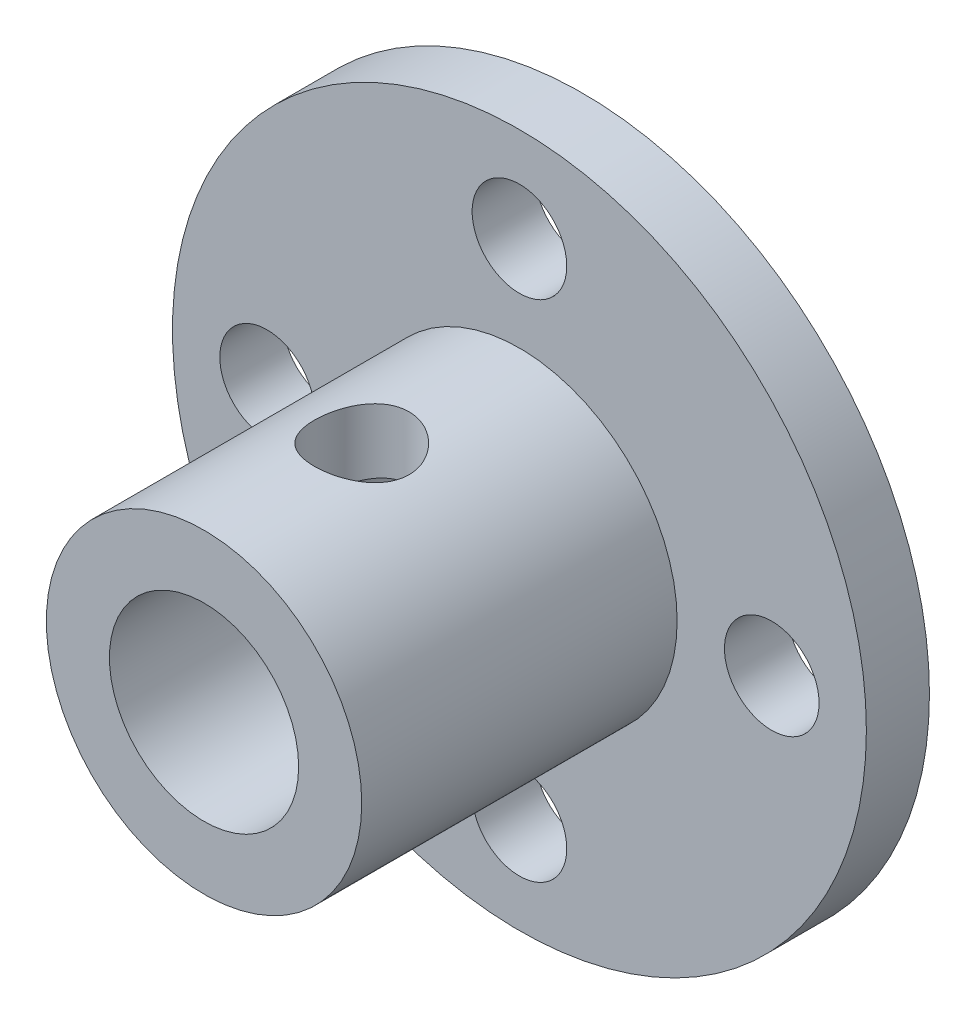
ISO-10303-21;
HEADER;
FILE_DESCRIPTION(('STEP AP214'),'2;1');
FILE_NAME('part.step','',(''),(''),'','','');
FILE_SCHEMA(('AUTOMOTIVE_DESIGN { 1 0 10303 214 1 1 1 1 }'));
ENDSEC;
DATA;
#1=APPLICATION_CONTEXT('core data for automotive mechanical design processes');
#2=APPLICATION_PROTOCOL_DEFINITION('international standard','automotive_design',2000,#1);
#3=PRODUCT_CONTEXT('',#1,'mechanical');
#4=PRODUCT('Part','Part','',(#3));
#5=PRODUCT_RELATED_PRODUCT_CATEGORY('part','',(#4));
#6=PRODUCT_DEFINITION_FORMATION('','',#4);
#7=PRODUCT_DEFINITION_CONTEXT('part definition',#1,'design');
#8=PRODUCT_DEFINITION('design','',#6,#7);
#9=PRODUCT_DEFINITION_SHAPE('','',#8);
#10=(LENGTH_UNIT() NAMED_UNIT(*) SI_UNIT(.MILLI.,.METRE.));
#11=(NAMED_UNIT(*) PLANE_ANGLE_UNIT() SI_UNIT($,.RADIAN.));
#12=(NAMED_UNIT(*) SI_UNIT($,.STERADIAN.) SOLID_ANGLE_UNIT());
#13=UNCERTAINTY_MEASURE_WITH_UNIT(LENGTH_MEASURE(1.E-05),#10,'distance_accuracy_value','');
#14=(GEOMETRIC_REPRESENTATION_CONTEXT(3) GLOBAL_UNCERTAINTY_ASSIGNED_CONTEXT((#13)) GLOBAL_UNIT_ASSIGNED_CONTEXT((#10,
#11,#12)) REPRESENTATION_CONTEXT('',''));
#15=CARTESIAN_POINT('',(0.,0.,0.));
#16=DIRECTION('',(0.,0.,1.));
#17=DIRECTION('',(1.,0.,0.));
#18=AXIS2_PLACEMENT_3D('',#15,#16,#17);
#19=CARTESIAN_POINT('',(0.,0.,2.));
#20=DIRECTION('',(0.,0.,-1.));
#21=DIRECTION('',(-1.,0.,0.));
#22=AXIS2_PLACEMENT_3D('',#19,#20,#21);
#23=CYLINDRICAL_SURFACE('',#22,11.);
#24=CARTESIAN_POINT('',(0.,0.,2.));
#25=DIRECTION('',(0.,0.,1.));
#26=DIRECTION('',(1.,0.,0.));
#27=AXIS2_PLACEMENT_3D('',#24,#25,#26);
#28=CIRCLE('',#27,11.);
#29=CARTESIAN_POINT('',(11.,0.,2.));
#30=VERTEX_POINT('',#29);
#31=EDGE_CURVE('E10',#30,#30,#28,.T.);
#32=ORIENTED_EDGE('',*,*,#31,.F.);
#33=EDGE_LOOP('',(#32));
#34=FACE_BOUND('',#33,.T.);
#35=CARTESIAN_POINT('',(0.,0.,0.));
#36=DIRECTION('',(0.,0.,1.));
#37=DIRECTION('',(1.,0.,0.));
#38=AXIS2_PLACEMENT_3D('',#35,#36,#37);
#39=CIRCLE('',#38,11.);
#40=CARTESIAN_POINT('',(11.,0.,0.));
#41=VERTEX_POINT('',#40);
#42=EDGE_CURVE('E50',#41,#41,#39,.T.);
#43=ORIENTED_EDGE('',*,*,#42,.T.);
#44=EDGE_LOOP('',(#43));
#45=FACE_BOUND('',#44,.T.);
#46=ADVANCED_FACE('F37',(#34,#45),#23,.T.);
#47=CARTESIAN_POINT('',(0.,0.,2.));
#48=DIRECTION('',(0.,0.,1.));
#49=DIRECTION('',(1.,0.,0.));
#50=AXIS2_PLACEMENT_3D('',#47,#48,#49);
#51=PLANE('',#50);
#52=CARTESIAN_POINT('',(-8.,0.,2.));
#53=DIRECTION('',(0.,0.,1.));
#54=DIRECTION('',(1.,0.,0.));
#55=AXIS2_PLACEMENT_3D('',#52,#53,#54);
#56=CIRCLE('',#55,1.5);
#57=CARTESIAN_POINT('',(-6.5,0.,2.));
#58=VERTEX_POINT('',#57);
#59=EDGE_CURVE('E67',#58,#58,#56,.T.);
#60=ORIENTED_EDGE('',*,*,#59,.F.);
#61=EDGE_LOOP('',(#60));
#62=FACE_BOUND('',#61,.T.);
#63=CARTESIAN_POINT('',(0.,8.,2.));
#64=DIRECTION('',(0.,0.,1.));
#65=DIRECTION('',(1.,0.,0.));
#66=AXIS2_PLACEMENT_3D('',#63,#64,#65);
#67=CIRCLE('',#66,1.5);
#68=CARTESIAN_POINT('',(1.50000000000003,8.,2.));
#69=VERTEX_POINT('',#68);
#70=EDGE_CURVE('E242',#69,#69,#67,.T.);
#71=ORIENTED_EDGE('',*,*,#70,.F.);
#72=EDGE_LOOP('',(#71));
#73=FACE_BOUND('',#72,.T.);
#74=CARTESIAN_POINT('',(8.,0.,2.));
#75=DIRECTION('',(0.,0.,1.));
#76=DIRECTION('',(1.,0.,0.));
#77=AXIS2_PLACEMENT_3D('',#74,#75,#76);
#78=CIRCLE('',#77,1.5);
#79=CARTESIAN_POINT('',(9.5,0.,2.));
#80=VERTEX_POINT('',#79);
#81=EDGE_CURVE('E246',#80,#80,#78,.T.);
#82=ORIENTED_EDGE('',*,*,#81,.F.);
#83=EDGE_LOOP('',(#82));
#84=FACE_BOUND('',#83,.T.);
#85=CARTESIAN_POINT('',(0.,-8.,2.));
#86=DIRECTION('',(0.,0.,1.));
#87=DIRECTION('',(1.,0.,0.));
#88=AXIS2_PLACEMENT_3D('',#85,#86,#87);
#89=CIRCLE('',#88,1.5);
#90=CARTESIAN_POINT('',(1.49999999999992,-8.,2.));
#91=VERTEX_POINT('',#90);
#92=EDGE_CURVE('E250',#91,#91,#89,.T.);
#93=ORIENTED_EDGE('',*,*,#92,.F.);
#94=EDGE_LOOP('',(#93));
#95=FACE_BOUND('',#94,.T.);
#96=CARTESIAN_POINT('',(0.,0.,2.));
#97=DIRECTION('',(0.,0.,1.));
#98=DIRECTION('',(1.,0.,0.));
#99=AXIS2_PLACEMENT_3D('',#96,#97,#98);
#100=CIRCLE('',#99,5.);
#101=CARTESIAN_POINT('',(5.,0.,2.));
#102=VERTEX_POINT('',#101);
#103=EDGE_CURVE('E59',#102,#102,#100,.T.);
#104=ORIENTED_EDGE('',*,*,#103,.F.);
#105=EDGE_LOOP('',(#104));
#106=FACE_BOUND('',#105,.T.);
#107=ORIENTED_EDGE('',*,*,#31,.T.);
#108=EDGE_LOOP('',(#107));
#109=FACE_BOUND('',#108,.T.);
#110=ADVANCED_FACE('F124',(#62,#73,#84,#95,#106,#109),#51,.T.);
#111=CARTESIAN_POINT('',(0.,0.,0.));
#112=DIRECTION('',(0.,0.,1.));
#113=DIRECTION('',(1.,0.,0.));
#114=AXIS2_PLACEMENT_3D('',#111,#112,#113);
#115=PLANE('',#114);
#116=CARTESIAN_POINT('',(-8.,0.,0.));
#117=DIRECTION('',(0.,0.,1.));
#118=DIRECTION('',(1.,0.,0.));
#119=AXIS2_PLACEMENT_3D('',#116,#117,#118);
#120=CIRCLE('',#119,1.5);
#121=CARTESIAN_POINT('',(-6.5,0.,0.));
#122=VERTEX_POINT('',#121);
#123=EDGE_CURVE('E79',#122,#122,#120,.T.);
#124=ORIENTED_EDGE('',*,*,#123,.T.);
#125=EDGE_LOOP('',(#124));
#126=FACE_BOUND('',#125,.T.);
#127=CARTESIAN_POINT('',(0.,8.,0.));
#128=DIRECTION('',(0.,0.,1.));
#129=DIRECTION('',(1.,0.,0.));
#130=AXIS2_PLACEMENT_3D('',#127,#128,#129);
#131=CIRCLE('',#130,1.5);
#132=CARTESIAN_POINT('',(1.50000000000003,8.,0.));
#133=VERTEX_POINT('',#132);
#134=EDGE_CURVE('E75',#133,#133,#131,.T.);
#135=ORIENTED_EDGE('',*,*,#134,.T.);
#136=EDGE_LOOP('',(#135));
#137=FACE_BOUND('',#136,.T.);
#138=CARTESIAN_POINT('',(8.,0.,0.));
#139=DIRECTION('',(0.,0.,1.));
#140=DIRECTION('',(1.,0.,0.));
#141=AXIS2_PLACEMENT_3D('',#138,#139,#140);
#142=CIRCLE('',#141,1.5);
#143=CARTESIAN_POINT('',(9.5,0.,0.));
#144=VERTEX_POINT('',#143);
#145=EDGE_CURVE('E71',#144,#144,#142,.T.);
#146=ORIENTED_EDGE('',*,*,#145,.T.);
#147=EDGE_LOOP('',(#146));
#148=FACE_BOUND('',#147,.T.);
#149=CARTESIAN_POINT('',(0.,-8.,0.));
#150=DIRECTION('',(0.,0.,1.));
#151=DIRECTION('',(1.,0.,0.));
#152=AXIS2_PLACEMENT_3D('',#149,#150,#151);
#153=CIRCLE('',#152,1.5);
#154=CARTESIAN_POINT('',(1.49999999999992,-8.,0.));
#155=VERTEX_POINT('',#154);
#156=EDGE_CURVE('E66',#155,#155,#153,.T.);
#157=ORIENTED_EDGE('',*,*,#156,.T.);
#158=EDGE_LOOP('',(#157));
#159=FACE_BOUND('',#158,.T.);
#160=CARTESIAN_POINT('',(0.,0.,0.));
#161=DIRECTION('',(0.,0.,1.));
#162=DIRECTION('',(1.,0.,0.));
#163=AXIS2_PLACEMENT_3D('',#160,#161,#162);
#164=CIRCLE('',#163,3.);
#165=CARTESIAN_POINT('',(3.,0.,0.));
#166=VERTEX_POINT('',#165);
#167=EDGE_CURVE('E62',#166,#166,#164,.T.);
#168=ORIENTED_EDGE('',*,*,#167,.T.);
#169=EDGE_LOOP('',(#168));
#170=FACE_BOUND('',#169,.T.);
#171=ORIENTED_EDGE('',*,*,#42,.F.);
#172=EDGE_LOOP('',(#171));
#173=FACE_BOUND('',#172,.T.);
#174=ADVANCED_FACE('F127',(#126,#137,#148,#159,#170,#173),#115,.F.);
#175=CARTESIAN_POINT('',(0.,0.,12.));
#176=DIRECTION('',(0.,0.,1.));
#177=DIRECTION('',(1.,0.,0.));
#178=AXIS2_PLACEMENT_3D('',#175,#176,#177);
#179=PLANE('',#178);
#180=CARTESIAN_POINT('',(0.,0.,12.));
#181=DIRECTION('',(0.,0.,1.));
#182=DIRECTION('',(1.,0.,0.));
#183=AXIS2_PLACEMENT_3D('',#180,#181,#182);
#184=CIRCLE('',#183,5.);
#185=CARTESIAN_POINT('',(5.,0.,12.));
#186=VERTEX_POINT('',#185);
#187=EDGE_CURVE('E56',#186,#186,#184,.T.);
#188=ORIENTED_EDGE('',*,*,#187,.T.);
#189=EDGE_LOOP('',(#188));
#190=FACE_BOUND('',#189,.T.);
#191=CARTESIAN_POINT('',(0.,0.,12.));
#192=DIRECTION('',(0.,0.,1.));
#193=DIRECTION('',(1.,0.,0.));
#194=AXIS2_PLACEMENT_3D('',#191,#192,#193);
#195=CIRCLE('',#194,3.);
#196=CARTESIAN_POINT('',(3.,0.,12.));
#197=VERTEX_POINT('',#196);
#198=EDGE_CURVE('E82',#197,#197,#195,.T.);
#199=ORIENTED_EDGE('',*,*,#198,.F.);
#200=EDGE_LOOP('',(#199));
#201=FACE_BOUND('',#200,.T.);
#202=ADVANCED_FACE('F122',(#190,#201),#179,.T.);
#203=CARTESIAN_POINT('',(0.,0.,12.));
#204=DIRECTION('',(0.,0.,-1.));
#205=DIRECTION('',(-1.,0.,0.));
#206=AXIS2_PLACEMENT_3D('',#203,#204,#205);
#207=CYLINDRICAL_SURFACE('',#206,5.);
#208=CARTESIAN_POINT('',(0.,-5.,8.5));
#209=CARTESIAN_POINT('',(0.0822886127533005,-4.9999992925055,8.49999900251511));
#210=CARTESIAN_POINT('',(0.16458731835153,-4.99794915693954,8.49320613637603));
#211=CARTESIAN_POINT('',(0.326788125304881,-4.98997105593691,8.4662786457779));
#212=CARTESIAN_POINT('',(0.40668950441142,-4.98404193389692,8.44614004197666));
#213=CARTESIAN_POINT('',(0.561732707754527,-4.96895552501836,8.39325398308974));
#214=CARTESIAN_POINT('',(0.636881364395373,-4.95980300250425,8.36052513038106));
#215=CARTESIAN_POINT('',(0.780624181053131,-4.93922109237645,8.28346390694416));
#216=CARTESIAN_POINT('',(0.84921746746967,-4.92779140192067,8.23912999260458));
#217=CARTESIAN_POINT('',(0.979871797183745,-4.90350737192774,8.13877599252733));
#218=CARTESIAN_POINT('',(1.04171807124434,-4.89062383657036,8.08248337411409));
#219=CARTESIAN_POINT('',(1.15524920923324,-4.86505834210442,7.96039077008981));
#220=CARTESIAN_POINT('',(1.20693236327441,-4.85237641724501,7.89458918787504));
#221=CARTESIAN_POINT('',(1.29980037723708,-4.82834113993772,7.75352924696239));
#222=CARTESIAN_POINT('',(1.34072309022214,-4.81702406663875,7.67809153900926));
#223=CARTESIAN_POINT('',(1.4092139477476,-4.79743620394031,7.52101074576971));
#224=CARTESIAN_POINT('',(1.43678529919973,-4.78916468313311,7.43936915607202));
#225=CARTESIAN_POINT('',(1.47701633682652,-4.77690870838434,7.27460973386954));
#226=CARTESIAN_POINT('',(1.49007196234677,-4.77281069324533,7.19159725613606));
#227=CARTESIAN_POINT('',(1.50213730614672,-4.76902789749767,7.02446684378324));
#228=CARTESIAN_POINT('',(1.50115042761078,-4.76934204760571,6.94034918194091));
#229=CARTESIAN_POINT('',(1.48546977199812,-4.77424744067778,6.77661609139152));
#230=CARTESIAN_POINT('',(1.47127205262685,-4.7786838859914,6.69694774963776));
#231=CARTESIAN_POINT('',(1.43037420427056,-4.79108356228624,6.54118021372654));
#232=CARTESIAN_POINT('',(1.40367284141641,-4.79904714132351,6.46508137262567));
#233=CARTESIAN_POINT('',(1.33816026653682,-4.81772733074973,6.31739965033926));
#234=CARTESIAN_POINT('',(1.29918816934643,-4.82848016115952,6.24589291604474));
#235=CARTESIAN_POINT('',(1.21035222588683,-4.85150987000064,6.11026797798981));
#236=CARTESIAN_POINT('',(1.16048574002588,-4.86378711746991,6.04615157058622));
#237=CARTESIAN_POINT('',(1.04881290765546,-4.88911011297937,5.92431380923798));
#238=CARTESIAN_POINT('',(0.986594907466973,-4.90216654310498,5.86697133597033));
#239=CARTESIAN_POINT('',(0.853263259313968,-4.92712244063259,5.76344601593575));
#240=CARTESIAN_POINT('',(0.782149051860889,-4.9390218351841,5.71726387158557));
#241=CARTESIAN_POINT('',(0.632355038342805,-4.9604316006947,5.63714007753527));
#242=CARTESIAN_POINT('',(0.553627749747952,-4.96992543668314,5.60328248375014));
#243=CARTESIAN_POINT('',(0.391245415603521,-4.98533521832222,5.54940040990037));
#244=CARTESIAN_POINT('',(0.307591751589583,-4.99125216186999,5.52937207146751));
#245=CARTESIAN_POINT('',(0.140952242668333,-4.99868364643538,5.50434782210061));
#246=CARTESIAN_POINT('',(0.0580500976011884,-5.0003485041779,5.49883841419839));
#247=CARTESIAN_POINT('',(-0.107499605823381,-4.9995292324176,5.50156915571208));
#248=CARTESIAN_POINT('',(-0.190147196690779,-4.99704565677756,5.50980746965144));
#249=CARTESIAN_POINT('',(-0.350903605309695,-4.98830696987163,5.53938461111149));
#250=CARTESIAN_POINT('',(-0.429072772614168,-4.98213829799417,5.56042338758087));
#251=CARTESIAN_POINT('',(-0.580754638954521,-4.96674347841533,5.6146432327782));
#252=CARTESIAN_POINT('',(-0.654266777025582,-4.95751696321085,5.64782576103786));
#253=CARTESIAN_POINT('',(-0.796437189461051,-4.93669654351325,5.72625316548113));
#254=CARTESIAN_POINT('',(-0.864943826199668,-4.92505280829675,5.77175934094797));
#255=CARTESIAN_POINT('',(-0.993523307980146,-4.90073468764318,5.87322475405281));
#256=CARTESIAN_POINT('',(-1.05359403235593,-4.8880600443108,5.92918661188767));
#257=CARTESIAN_POINT('',(-1.16585744551027,-4.86253171869138,6.05238730836934));
#258=CARTESIAN_POINT('',(-1.21768481231503,-4.84968825033268,6.11996187577174));
#259=CARTESIAN_POINT('',(-1.30928995072153,-4.82576515238463,6.26312793901353));
#260=CARTESIAN_POINT('',(-1.34906803829472,-4.81468547654651,6.33871922455821));
#261=CARTESIAN_POINT('',(-1.41517347127168,-4.79567189615055,6.49553249125469));
#262=CARTESIAN_POINT('',(-1.4415634693705,-4.78772337843827,6.57672618653659));
#263=CARTESIAN_POINT('',(-1.48021730815114,-4.77591594362794,6.74268796893148));
#264=CARTESIAN_POINT('',(-1.49248598978779,-4.772055625083,6.82745482078767));
#265=CARTESIAN_POINT('',(-1.50221984485059,-4.76899972496087,6.99436151837623));
#266=CARTESIAN_POINT('',(-1.5002805530849,-4.76961647442755,7.07646365101758));
#267=CARTESIAN_POINT('',(-1.48307505444813,-4.77499401288294,7.2391141033728));
#268=CARTESIAN_POINT('',(-1.46780938124716,-4.77975463592551,7.31966248517635));
#269=CARTESIAN_POINT('',(-1.42476888804136,-4.79275763670386,7.47594539914285));
#270=CARTESIAN_POINT('',(-1.39715175507068,-4.80095604545965,7.55172728736169));
#271=CARTESIAN_POINT('',(-1.33031507121129,-4.81990278909136,7.69764243881772));
#272=CARTESIAN_POINT('',(-1.29109329962876,-4.83065161194312,7.76777461764076));
#273=CARTESIAN_POINT('',(-1.20048763805072,-4.85397676425833,7.90316311652711));
#274=CARTESIAN_POINT('',(-1.14871276092994,-4.86660540163798,7.96814876126041));
#275=CARTESIAN_POINT('',(-1.03517434629782,-4.89201320450026,8.08870249830786));
#276=CARTESIAN_POINT('',(-0.973408217134501,-4.90479240823905,8.14426813946776));
#277=CARTESIAN_POINT('',(-0.839465762183248,-4.92950936570649,8.24602341229503));
#278=CARTESIAN_POINT('',(-0.767037885790608,-4.94141159765674,8.29189144685549));
#279=CARTESIAN_POINT('',(-0.615141373983529,-4.96260680455813,8.37073516990402));
#280=CARTESIAN_POINT('',(-0.535676052998955,-4.97190099931067,8.40371688827451));
#281=CARTESIAN_POINT('',(-0.380757712655281,-4.98602174969301,8.45289527565275));
#282=CARTESIAN_POINT('',(-0.305786961954234,-4.99122027381068,8.47051167288325));
#283=CARTESIAN_POINT('',(-0.153880195230779,-4.99820944494492,8.49406352524158));
#284=CARTESIAN_POINT('',(-0.076944509858139,-5.0000006615474,8.50000093270482));
#285=CARTESIAN_POINT('',(0.,-5.,8.5));
#286=B_SPLINE_CURVE_WITH_KNOTS('',3,(#208,#209,#210,#211,#212,#213,#214,#215,#216,#217,#218,
#219,#220,#221,#222,#223,#224,#225,#226,#227,#228,#229,#230,#231,#232,#233,#234,#235,#236,#237,
#238,#239,#240,#241,#242,#243,#244,#245,#246,#247,#248,#249,#250,#251,#252,#253,#254,#255,#256,
#257,#258,#259,#260,#261,#262,#263,#264,#265,#266,#267,#268,#269,#270,#271,#272,#273,#274,#275,
#276,#277,#278,#279,#280,#281,#282,#283,#284,#285),.UNSPECIFIED.,.T.,.F.,(4,2,2,2,2,2,2,2,2,2,2,
2,2,2,2,2,2,2,2,2,2,2,2,2,2,2,2,2,2,2,2,2,2,2,2,2,2,2,4),(0.,0.24658320361261,0.493239964845999,
0.739533676300874,0.985860164412701,1.23855602948191,1.49129437288633,1.74971481004109,
2.00807314543224,2.25919689356599,2.51025978319089,2.75226016697676,2.99428443658001,
3.23962426447119,3.48502360158555,3.74067104048167,3.99633456531071,4.25371046881689,
4.51101453528808,4.75908809438545,5.00712853550327,5.24956746682327,5.49203554593729,
5.74011305702908,5.98825282000191,6.24540400322818,6.5025484425268,6.75847814951252,
7.01432009460283,7.25950155466943,7.504673196616,7.74680040402721,7.98897397553107,
8.23996925679931,8.49102974897502,8.74942996156671,9.00770911595235,9.2383169193046,
9.46888616948875),.UNSPECIFIED.);
#287=CARTESIAN_POINT('',(0.,-5.,8.5));
#288=VERTEX_POINT('',#287);
#289=EDGE_CURVE('E113',#288,#288,#286,.T.);
#290=ORIENTED_EDGE('',*,*,#289,.T.);
#291=EDGE_LOOP('',(#290));
#292=FACE_BOUND('',#291,.T.);
#293=CARTESIAN_POINT('',(0.,5.,8.5));
#294=CARTESIAN_POINT('',(-0.0822886127533,4.9999992925055,8.49999900251511));
#295=CARTESIAN_POINT('',(-0.164587318351529,4.99794915693954,8.49320613637603));
#296=CARTESIAN_POINT('',(-0.326788125304881,4.98997105593691,8.4662786457779));
#297=CARTESIAN_POINT('',(-0.40668950441142,4.98404193389692,8.44614004197666));
#298=CARTESIAN_POINT('',(-0.561732707754527,4.96895552501836,8.39325398308974));
#299=CARTESIAN_POINT('',(-0.636881364395373,4.95980300250425,8.36052513038106));
#300=CARTESIAN_POINT('',(-0.780624181053131,4.93922109237645,8.28346390694416));
#301=CARTESIAN_POINT('',(-0.84921746746967,4.92779140192067,8.23912999260458));
#302=CARTESIAN_POINT('',(-0.979871797183745,4.90350737192774,8.13877599252733));
#303=CARTESIAN_POINT('',(-1.04171807124434,4.89062383657036,8.08248337411409));
#304=CARTESIAN_POINT('',(-1.15524920923324,4.86505834210442,7.96039077008981));
#305=CARTESIAN_POINT('',(-1.20693236327441,4.85237641724501,7.89458918787504));
#306=CARTESIAN_POINT('',(-1.29980037723708,4.82834113993772,7.75352924696239));
#307=CARTESIAN_POINT('',(-1.34072309022213,4.81702406663875,7.67809153900926));
#308=CARTESIAN_POINT('',(-1.4092139477476,4.79743620394031,7.52101074576971));
#309=CARTESIAN_POINT('',(-1.43678529919973,4.78916468313311,7.43936915607202));
#310=CARTESIAN_POINT('',(-1.47701633682652,4.77690870838434,7.27460973386954));
#311=CARTESIAN_POINT('',(-1.49007196234677,4.77281069324533,7.19159725613606));
#312=CARTESIAN_POINT('',(-1.50213730614672,4.76902789749767,7.02446684378323));
#313=CARTESIAN_POINT('',(-1.50115042761078,4.76934204760571,6.94034918194091));
#314=CARTESIAN_POINT('',(-1.48546977199812,4.77424744067778,6.77661609139152));
#315=CARTESIAN_POINT('',(-1.47127205262685,4.77868388599141,6.69694774963776));
#316=CARTESIAN_POINT('',(-1.43037420427056,4.79108356228624,6.54118021372654));
#317=CARTESIAN_POINT('',(-1.40367284141641,4.79904714132351,6.46508137262567));
#318=CARTESIAN_POINT('',(-1.33816026653682,4.81772733074973,6.31739965033926));
#319=CARTESIAN_POINT('',(-1.29918816934642,4.82848016115952,6.24589291604474));
#320=CARTESIAN_POINT('',(-1.21035222588683,4.85150987000065,6.11026797798981));
#321=CARTESIAN_POINT('',(-1.16048574002588,4.86378711746991,6.04615157058622));
#322=CARTESIAN_POINT('',(-1.04881290765546,4.88911011297937,5.92431380923798));
#323=CARTESIAN_POINT('',(-0.986594907466971,4.90216654310498,5.86697133597033));
#324=CARTESIAN_POINT('',(-0.853263259313966,4.92712244063259,5.76344601593575));
#325=CARTESIAN_POINT('',(-0.782149051860887,4.9390218351841,5.71726387158557));
#326=CARTESIAN_POINT('',(-0.632355038342802,4.9604316006947,5.63714007753527));
#327=CARTESIAN_POINT('',(-0.553627749747949,4.96992543668314,5.60328248375014));
#328=CARTESIAN_POINT('',(-0.391245415603518,4.98533521832222,5.54940040990037));
#329=CARTESIAN_POINT('',(-0.30759175158958,4.99125216186999,5.52937207146751));
#330=CARTESIAN_POINT('',(-0.14095224266833,4.99868364643538,5.5043478221006));
#331=CARTESIAN_POINT('',(-0.0580500976011855,5.0003485041779,5.49883841419839));
#332=CARTESIAN_POINT('',(0.107499605823384,4.9995292324176,5.50156915571208));
#333=CARTESIAN_POINT('',(0.190147196690782,4.99704565677756,5.50980746965144));
#334=CARTESIAN_POINT('',(0.350903605309698,4.98830696987163,5.53938461111149));
#335=CARTESIAN_POINT('',(0.42907277261417,4.98213829799417,5.56042338758087));
#336=CARTESIAN_POINT('',(0.580754638954523,4.96674347841533,5.6146432327782));
#337=CARTESIAN_POINT('',(0.654266777025585,4.95751696321085,5.64782576103786));
#338=CARTESIAN_POINT('',(0.796437189461053,4.93669654351325,5.72625316548113));
#339=CARTESIAN_POINT('',(0.86494382619967,4.92505280829675,5.77175934094797));
#340=CARTESIAN_POINT('',(0.993523307980147,4.90073468764317,5.87322475405281));
#341=CARTESIAN_POINT('',(1.05359403235594,4.8880600443108,5.92918661188767));
#342=CARTESIAN_POINT('',(1.16585744551027,4.86253171869138,6.05238730836934));
#343=CARTESIAN_POINT('',(1.21768481231504,4.84968825033268,6.11996187577174));
#344=CARTESIAN_POINT('',(1.30928995072154,4.82576515238464,6.26312793901353));
#345=CARTESIAN_POINT('',(1.34906803829472,4.81468547654651,6.33871922455821));
#346=CARTESIAN_POINT('',(1.41517347127168,4.79567189615055,6.49553249125469));
#347=CARTESIAN_POINT('',(1.4415634693705,4.78772337843827,6.57672618653659));
#348=CARTESIAN_POINT('',(1.48021730815114,4.77591594362794,6.74268796893148));
#349=CARTESIAN_POINT('',(1.49248598978779,4.772055625083,6.82745482078767));
#350=CARTESIAN_POINT('',(1.50221984485059,4.76899972496087,6.99436151837623));
#351=CARTESIAN_POINT('',(1.5002805530849,4.76961647442754,7.07646365101759));
#352=CARTESIAN_POINT('',(1.48307505444813,4.77499401288294,7.2391141033728));
#353=CARTESIAN_POINT('',(1.46780938124716,4.77975463592551,7.31966248517635));
#354=CARTESIAN_POINT('',(1.42476888804136,4.79275763670386,7.47594539914285));
#355=CARTESIAN_POINT('',(1.39715175507068,4.80095604545965,7.55172728736169));
#356=CARTESIAN_POINT('',(1.33031507121129,4.81990278909136,7.69764243881772));
#357=CARTESIAN_POINT('',(1.29109329962876,4.83065161194312,7.76777461764076));
#358=CARTESIAN_POINT('',(1.20048763805072,4.85397676425833,7.90316311652711));
#359=CARTESIAN_POINT('',(1.14871276092994,4.86660540163798,7.96814876126041));
#360=CARTESIAN_POINT('',(1.03517434629782,4.89201320450026,8.08870249830786));
#361=CARTESIAN_POINT('',(0.973408217134501,4.90479240823905,8.14426813946776));
#362=CARTESIAN_POINT('',(0.839465762183248,4.92950936570649,8.24602341229503));
#363=CARTESIAN_POINT('',(0.767037885790607,4.94141159765674,8.29189144685549));
#364=CARTESIAN_POINT('',(0.61514137398353,4.96260680455813,8.37073516990402));
#365=CARTESIAN_POINT('',(0.535676052998955,4.97190099931067,8.40371688827451));
#366=CARTESIAN_POINT('',(0.380757712655282,4.98602174969301,8.45289527565275));
#367=CARTESIAN_POINT('',(0.305786961954235,4.99122027381068,8.47051167288325));
#368=CARTESIAN_POINT('',(0.15388019523078,4.99820944494492,8.49406352524158));
#369=CARTESIAN_POINT('',(0.0769445098581397,5.0000006615474,8.50000093270482));
#370=CARTESIAN_POINT('',(0.,5.,8.5));
#371=B_SPLINE_CURVE_WITH_KNOTS('',3,(#293,#294,#295,#296,#297,#298,#299,#300,#301,#302,#303,
#304,#305,#306,#307,#308,#309,#310,#311,#312,#313,#314,#315,#316,#317,#318,#319,#320,#321,#322,
#323,#324,#325,#326,#327,#328,#329,#330,#331,#332,#333,#334,#335,#336,#337,#338,#339,#340,#341,
#342,#343,#344,#345,#346,#347,#348,#349,#350,#351,#352,#353,#354,#355,#356,#357,#358,#359,#360,
#361,#362,#363,#364,#365,#366,#367,#368,#369,#370),.UNSPECIFIED.,.T.,.F.,(4,2,2,2,2,2,2,2,2,2,2,
2,2,2,2,2,2,2,2,2,2,2,2,2,2,2,2,2,2,2,2,2,2,2,2,2,2,2,4),(0.,0.246583203612611,
0.493239964845999,0.739533676300874,0.985860164412702,1.23855602948192,1.49129437288633,
1.74971481004109,2.00807314543223,2.25919689356599,2.51025978319089,2.75226016697676,
2.99428443658001,3.2396242644712,3.48502360158556,3.74067104048167,3.99633456531072,
4.25371046881689,4.51101453528808,4.75908809438545,5.00712853550327,5.24956746682327,
5.49203554593729,5.74011305702908,5.98825282000191,6.24540400322819,6.5025484425268,
6.75847814951252,7.01432009460283,7.25950155466943,7.504673196616,7.74680040402721,
7.98897397553107,8.23996925679931,8.49102974897502,8.74942996156671,9.00770911595235,
9.23831691930459,9.46888616948874),.UNSPECIFIED.);
#372=CARTESIAN_POINT('',(0.,5.,8.5));
#373=VERTEX_POINT('',#372);
#374=EDGE_CURVE('E106',#373,#373,#371,.T.);
#375=ORIENTED_EDGE('',*,*,#374,.T.);
#376=EDGE_LOOP('',(#375));
#377=FACE_BOUND('',#376,.T.);
#378=ORIENTED_EDGE('',*,*,#187,.F.);
#379=EDGE_LOOP('',(#378));
#380=FACE_BOUND('',#379,.T.);
#381=ORIENTED_EDGE('',*,*,#103,.T.);
#382=EDGE_LOOP('',(#381));
#383=FACE_BOUND('',#382,.T.);
#384=ADVANCED_FACE('F118',(#292,#377,#380,#383),#207,.T.);
#385=CARTESIAN_POINT('',(0.,0.,12.));
#386=DIRECTION('',(0.,0.,-1.));
#387=DIRECTION('',(-1.,0.,0.));
#388=AXIS2_PLACEMENT_3D('',#385,#386,#387);
#389=CYLINDRICAL_SURFACE('',#388,3.);
#390=CARTESIAN_POINT('',(0.,-3.,8.5));
#391=CARTESIAN_POINT('',(0.0788579444268509,-2.99999570107562,8.49999504652421));
#392=CARTESIAN_POINT('',(0.157809899546344,-2.99685736529635,8.49374489031842));
#393=CARTESIAN_POINT('',(0.313380352903345,-2.98461234055736,8.46902067948769));
#394=CARTESIAN_POINT('',(0.389994130070445,-2.97549431743379,8.45052341050328));
#395=CARTESIAN_POINT('',(0.538400317320674,-2.95224419105063,8.40220928707506));
#396=CARTESIAN_POINT('',(0.61021020440872,-2.93813158766306,8.37243642362805));
#397=CARTESIAN_POINT('',(0.747708925209899,-2.90618664773642,8.30264406795252));
#398=CARTESIAN_POINT('',(0.813398240985089,-2.88835460450288,8.2626253836267));
#399=CARTESIAN_POINT('',(0.941261726642865,-2.84934387387093,8.17072412577207));
#400=CARTESIAN_POINT('',(1.00298281668316,-2.82802798691306,8.11827028114054));
#401=CARTESIAN_POINT('',(1.11716916730047,-2.78489955370114,8.00421778112944));
#402=CARTESIAN_POINT('',(1.16962737466015,-2.76308664313552,7.94261222234134));
#403=CARTESIAN_POINT('',(1.26787800067542,-2.71948426796021,7.80627497571493));
#404=CARTESIAN_POINT('',(1.31283800332746,-2.69782780455198,7.73089585248113));
#405=CARTESIAN_POINT('',(1.38925234033604,-2.65928968158481,7.57244899602068));
#406=CARTESIAN_POINT('',(1.4207163224495,-2.64240461410484,7.48938680691588));
#407=CARTESIAN_POINT('',(1.46719866328288,-2.61686800556713,7.32300234186712));
#408=CARTESIAN_POINT('',(1.48308878562066,-2.6077840737557,7.23999332189891));
#409=CARTESIAN_POINT('',(1.50064048996327,-2.59772834922792,7.07203174333078));
#410=CARTESIAN_POINT('',(1.50231613255961,-2.59674854014932,6.98708118869327));
#411=CARTESIAN_POINT('',(1.49203093075844,-2.60266395385873,6.82857096352695));
#412=CARTESIAN_POINT('',(1.48167683930523,-2.6086314549302,6.75486395316542));
#413=CARTESIAN_POINT('',(1.4504097735854,-2.62614343100775,6.61041713594044));
#414=CARTESIAN_POINT('',(1.42949343584648,-2.63768968247664,6.53967828204203));
#415=CARTESIAN_POINT('',(1.37731467057901,-2.66531214619112,6.40115630115151));
#416=CARTESIAN_POINT('',(1.34582260067399,-2.68148760995998,6.33348040182132));
#417=CARTESIAN_POINT('',(1.273562531502,-2.71655106422106,6.20404856111499));
#418=CARTESIAN_POINT('',(1.2327903657187,-2.73544027170286,6.14229529659987));
#419=CARTESIAN_POINT('',(1.13709908236918,-2.77669736854929,6.01821812088516));
#420=CARTESIAN_POINT('',(1.08104168755392,-2.79920265355119,5.95681468963576));
#421=CARTESIAN_POINT('',(0.959333368112062,-2.84321434950611,5.84389687211365));
#422=CARTESIAN_POINT('',(0.89367788486143,-2.86472027938201,5.79238721194917));
#423=CARTESIAN_POINT('',(0.750774758747774,-2.90552980924446,5.69847150845541));
#424=CARTESIAN_POINT('',(0.673130387399114,-2.92468476243011,5.65659929133139));
#425=CARTESIAN_POINT('',(0.510699323233196,-2.95736821681863,5.58685445643549));
#426=CARTESIAN_POINT('',(0.425918364397915,-2.9709011841533,5.55897072247725));
#427=CARTESIAN_POINT('',(0.259149737491055,-2.98986500612153,5.52028689442498));
#428=CARTESIAN_POINT('',(0.177512295822491,-2.99587407451965,5.50826314637983));
#429=CARTESIAN_POINT('',(0.0131693999240289,-3.00109520188655,5.49780290329827));
#430=CARTESIAN_POINT('',(-0.0695355298048616,-3.00031048081978,5.4993599715408));
#431=CARTESIAN_POINT('',(-0.226849457978979,-2.99236788380152,5.51531003262811));
#432=CARTESIAN_POINT('',(-0.301589112074894,-2.98570868532253,5.52869879909499));
#433=CARTESIAN_POINT('',(-0.44761033845291,-2.9673325697226,5.56635710784268));
#434=CARTESIAN_POINT('',(-0.518891528536629,-2.95561509501618,5.59062784968024));
#435=CARTESIAN_POINT('',(-0.658332912674357,-2.92776377120382,5.64999769964955));
#436=CARTESIAN_POINT('',(-0.726345595508703,-2.91151322654446,5.68538657517443));
#437=CARTESIAN_POINT('',(-0.855692042548906,-2.87615961476127,5.76566130346985));
#438=CARTESIAN_POINT('',(-0.917022944664886,-2.85705533350408,5.81055120189309));
#439=CARTESIAN_POINT('',(-1.03765153393382,-2.81562332004297,5.91364063799607));
#440=CARTESIAN_POINT('',(-1.09615811672854,-2.79316327265249,5.97271430266772));
#441=CARTESIAN_POINT('',(-1.20278448167828,-2.7489358741323,6.09988772691659));
#442=CARTESIAN_POINT('',(-1.25089707856781,-2.72716901100071,6.16799367827188));
#443=CARTESIAN_POINT('',(-1.33756187171853,-2.68576788309734,6.31546548125946));
#444=CARTESIAN_POINT('',(-1.37553824370037,-2.66628794383591,6.39521689914172));
#445=CARTESIAN_POINT('',(-1.43712423890206,-2.63361108441202,6.56126510136245));
#446=CARTESIAN_POINT('',(-1.46075237380052,-2.62040607332625,6.64755328970033));
#447=CARTESIAN_POINT('',(-1.49079253120031,-2.60342251538703,6.81536533432705));
#448=CARTESIAN_POINT('',(-1.49863949460818,-2.59886075197597,6.89655138015286));
#449=CARTESIAN_POINT('',(-1.5010337315643,-2.59748031962405,7.05917060074679));
#450=CARTESIAN_POINT('',(-1.49558676993486,-2.60065829439585,7.14060365310679));
#451=CARTESIAN_POINT('',(-1.47288918838996,-2.61356793076615,7.29322525230015));
#452=CARTESIAN_POINT('',(-1.45681247151455,-2.62264641723988,7.36465070521711));
#453=CARTESIAN_POINT('',(-1.41476303733662,-2.64556524281479,7.50371217913655));
#454=CARTESIAN_POINT('',(-1.38878713673988,-2.65940711354503,7.57134697313805));
#455=CARTESIAN_POINT('',(-1.32572361795085,-2.69142795546804,7.7059372764798));
#456=CARTESIAN_POINT('',(-1.28800670672355,-2.70983583593881,7.77254185274354));
#457=CARTESIAN_POINT('',(-1.20322645745609,-2.74852997452291,7.89891180427189));
#458=CARTESIAN_POINT('',(-1.15615825686234,-2.76881720693416,7.95867359578167));
#459=CARTESIAN_POINT('',(-1.04730498999206,-2.81193484737138,8.07721297353201));
#460=CARTESIAN_POINT('',(-0.984426634495893,-2.83477474959942,8.13498865352543));
#461=CARTESIAN_POINT('',(-0.849232209349796,-2.87816628389896,8.2393944751529));
#462=CARTESIAN_POINT('',(-0.776911084957796,-2.89871667939293,8.28601860920486));
#463=CARTESIAN_POINT('',(-0.623897395174419,-2.93547014349806,8.3668545440681));
#464=CARTESIAN_POINT('',(-0.543149255665097,-2.95164144740899,8.4009762538547));
#465=CARTESIAN_POINT('',(-0.376113151707131,-2.9775201194848,8.45471225163611));
#466=CARTESIAN_POINT('',(-0.289841699383651,-2.98724585044602,8.47436777020857));
#467=CARTESIAN_POINT('',(-0.168902919736343,-2.99543192870217,8.49084611662861));
#468=CARTESIAN_POINT('',(-0.135242819162347,-2.99714048010376,8.49427396129951));
#469=CARTESIAN_POINT('',(-0.0677275977076365,-2.99942545465223,8.49885199827113));
#470=CARTESIAN_POINT('',(-0.0338724714699419,-3.00000184655071,8.50000212770531));
#471=CARTESIAN_POINT('',(0.,-3.,8.5));
#472=B_SPLINE_CURVE_WITH_KNOTS('',3,(#390,#391,#392,#393,#394,#395,#396,#397,#398,#399,#400,
#401,#402,#403,#404,#405,#406,#407,#408,#409,#410,#411,#412,#413,#414,#415,#416,#417,#418,#419,
#420,#421,#422,#423,#424,#425,#426,#427,#428,#429,#430,#431,#432,#433,#434,#435,#436,#437,#438,
#439,#440,#441,#442,#443,#444,#445,#446,#447,#448,#449,#450,#451,#452,#453,#454,#455,#456,#457,
#458,#459,#460,#461,#462,#463,#464,#465,#466,#467,#468,#469,#470,#471),.UNSPECIFIED.,.T.,.F.,(4,
2,2,2,2,2,2,2,2,2,2,2,2,2,2,2,2,2,2,2,2,2,2,2,2,2,2,2,2,2,2,2,2,2,2,2,2,2,2,2,4),(0.,
0.236436386130439,0.473322224563796,0.709293233238448,0.945245640872351,1.19547263807713,
1.44588935648105,1.71572589646129,1.98536921847421,2.23887018210344,2.49212035993531,
2.71508568613981,2.93812205888518,3.16635360252731,3.39468781890333,3.65197412000818,
3.9093830189803,4.17874533321661,4.44789325368419,4.69474935707018,4.94148846767214,
5.16910359759183,5.39674382446397,5.63089284041848,5.86514176122509,6.12239415966628,
6.37982382923148,6.64972023242589,6.91926767918176,7.1629396125457,7.40650589797018,
7.62686895373284,7.84730293182527,8.08254685170431,8.31791341715446,8.58187864135757,
8.84598575071869,9.1119602049529,9.37717362931724,9.47872920200876,9.58028757766599),.UNSPECIFIED.);
#473=CARTESIAN_POINT('',(0.,-3.,8.5));
#474=VERTEX_POINT('',#473);
#475=EDGE_CURVE('E40',#474,#474,#472,.T.);
#476=ORIENTED_EDGE('',*,*,#475,.F.);
#477=EDGE_LOOP('',(#476));
#478=FACE_BOUND('',#477,.T.);
#479=CARTESIAN_POINT('',(0.,3.,8.5));
#480=CARTESIAN_POINT('',(-0.0788579444268497,2.99999570107562,8.49999504652421));
#481=CARTESIAN_POINT('',(-0.157809899546343,2.99685736529635,8.49374489031842));
#482=CARTESIAN_POINT('',(-0.313380352903344,2.98461234055736,8.46902067948769));
#483=CARTESIAN_POINT('',(-0.389994130070444,2.97549431743379,8.45052341050328));
#484=CARTESIAN_POINT('',(-0.538400317320673,2.95224419105063,8.40220928707506));
#485=CARTESIAN_POINT('',(-0.610210204408719,2.93813158766306,8.37243642362805));
#486=CARTESIAN_POINT('',(-0.747708925209898,2.90618664773642,8.30264406795252));
#487=CARTESIAN_POINT('',(-0.813398240985088,2.88835460450288,8.2626253836267));
#488=CARTESIAN_POINT('',(-0.941261726642863,2.84934387387093,8.17072412577207));
#489=CARTESIAN_POINT('',(-1.00298281668316,2.82802798691306,8.11827028114054));
#490=CARTESIAN_POINT('',(-1.11716916730047,2.78489955370115,8.00421778112944));
#491=CARTESIAN_POINT('',(-1.16962737466015,2.76308664313552,7.94261222234134));
#492=CARTESIAN_POINT('',(-1.26787800067542,2.71948426796021,7.80627497571493));
#493=CARTESIAN_POINT('',(-1.31283800332745,2.69782780455198,7.73089585248113));
#494=CARTESIAN_POINT('',(-1.38925234033604,2.65928968158481,7.57244899602068));
#495=CARTESIAN_POINT('',(-1.4207163224495,2.64240461410484,7.48938680691588));
#496=CARTESIAN_POINT('',(-1.46719866328288,2.61686800556713,7.32300234186712));
#497=CARTESIAN_POINT('',(-1.48308878562066,2.6077840737557,7.23999332189891));
#498=CARTESIAN_POINT('',(-1.50064048996327,2.59772834922792,7.07203174333078));
#499=CARTESIAN_POINT('',(-1.50231613255961,2.59674854014932,6.98708118869327));
#500=CARTESIAN_POINT('',(-1.49203093075844,2.60266395385873,6.82857096352695));
#501=CARTESIAN_POINT('',(-1.48167683930523,2.6086314549302,6.75486395316542));
#502=CARTESIAN_POINT('',(-1.4504097735854,2.62614343100775,6.61041713594044));
#503=CARTESIAN_POINT('',(-1.42949343584648,2.63768968247664,6.53967828204203));
#504=CARTESIAN_POINT('',(-1.37731467057901,2.66531214619112,6.40115630115151));
#505=CARTESIAN_POINT('',(-1.34582260067399,2.68148760995998,6.33348040182132));
#506=CARTESIAN_POINT('',(-1.273562531502,2.71655106422106,6.20404856111499));
#507=CARTESIAN_POINT('',(-1.2327903657187,2.73544027170286,6.14229529659987));
#508=CARTESIAN_POINT('',(-1.13709908236918,2.77669736854929,6.01821812088516));
#509=CARTESIAN_POINT('',(-1.08104168755392,2.79920265355119,5.95681468963576));
#510=CARTESIAN_POINT('',(-0.95933336811206,2.84321434950611,5.84389687211365));
#511=CARTESIAN_POINT('',(-0.893677884861428,2.86472027938201,5.79238721194917));
#512=CARTESIAN_POINT('',(-0.750774758747772,2.90552980924446,5.69847150845541));
#513=CARTESIAN_POINT('',(-0.673130387399113,2.92468476243011,5.65659929133139));
#514=CARTESIAN_POINT('',(-0.510699323233194,2.95736821681863,5.58685445643549));
#515=CARTESIAN_POINT('',(-0.425918364397913,2.9709011841533,5.55897072247725));
#516=CARTESIAN_POINT('',(-0.259149737491053,2.98986500612153,5.52028689442498));
#517=CARTESIAN_POINT('',(-0.177512295822489,2.99587407451965,5.50826314637983));
#518=CARTESIAN_POINT('',(-0.0131693999240269,3.00109520188655,5.49780290329827));
#519=CARTESIAN_POINT('',(0.0695355298048637,3.00031048081978,5.4993599715408));
#520=CARTESIAN_POINT('',(0.226849457978981,2.99236788380152,5.51531003262811));
#521=CARTESIAN_POINT('',(0.301589112074896,2.98570868532252,5.52869879909499));
#522=CARTESIAN_POINT('',(0.447610338452912,2.9673325697226,5.56635710784268));
#523=CARTESIAN_POINT('',(0.518891528536631,2.95561509501618,5.59062784968024));
#524=CARTESIAN_POINT('',(0.65833291267436,2.92776377120382,5.64999769964955));
#525=CARTESIAN_POINT('',(0.726345595508705,2.91151322654446,5.68538657517443));
#526=CARTESIAN_POINT('',(0.855692042548908,2.87615961476126,5.76566130346985));
#527=CARTESIAN_POINT('',(0.917022944664888,2.85705533350407,5.81055120189309));
#528=CARTESIAN_POINT('',(1.03765153393382,2.81562332004297,5.91364063799607));
#529=CARTESIAN_POINT('',(1.09615811672854,2.79316327265249,5.97271430266772));
#530=CARTESIAN_POINT('',(1.20278448167828,2.7489358741323,6.09988772691659));
#531=CARTESIAN_POINT('',(1.25089707856781,2.72716901100071,6.16799367827188));
#532=CARTESIAN_POINT('',(1.33756187171853,2.68576788309734,6.31546548125946));
#533=CARTESIAN_POINT('',(1.37553824370037,2.66628794383591,6.39521689914172));
#534=CARTESIAN_POINT('',(1.43712423890206,2.63361108441202,6.56126510136245));
#535=CARTESIAN_POINT('',(1.46075237380053,2.62040607332625,6.64755328970033));
#536=CARTESIAN_POINT('',(1.49079253120031,2.60342251538703,6.81536533432705));
#537=CARTESIAN_POINT('',(1.49863949460818,2.59886075197597,6.89655138015286));
#538=CARTESIAN_POINT('',(1.5010337315643,2.59748031962405,7.05917060074679));
#539=CARTESIAN_POINT('',(1.49558676993486,2.60065829439585,7.14060365310679));
#540=CARTESIAN_POINT('',(1.47288918838997,2.61356793076615,7.29322525230015));
#541=CARTESIAN_POINT('',(1.45681247151455,2.62264641723988,7.36465070521711));
#542=CARTESIAN_POINT('',(1.41476303733662,2.64556524281479,7.50371217913655));
#543=CARTESIAN_POINT('',(1.38878713673988,2.65940711354503,7.57134697313805));
#544=CARTESIAN_POINT('',(1.32572361795085,2.69142795546803,7.7059372764798));
#545=CARTESIAN_POINT('',(1.28800670672355,2.70983583593881,7.77254185274354));
#546=CARTESIAN_POINT('',(1.20322645745609,2.74852997452291,7.89891180427189));
#547=CARTESIAN_POINT('',(1.15615825686234,2.76881720693416,7.95867359578167));
#548=CARTESIAN_POINT('',(1.04730498999206,2.81193484737138,8.07721297353201));
#549=CARTESIAN_POINT('',(0.984426634495893,2.83477474959942,8.13498865352544));
#550=CARTESIAN_POINT('',(0.849232209349797,2.87816628389896,8.2393944751529));
#551=CARTESIAN_POINT('',(0.776911084957796,2.89871667939293,8.28601860920486));
#552=CARTESIAN_POINT('',(0.623897395174419,2.93547014349806,8.3668545440681));
#553=CARTESIAN_POINT('',(0.543149255665096,2.95164144740899,8.4009762538547));
#554=CARTESIAN_POINT('',(0.37611315170713,2.9775201194848,8.45471225163611));
#555=CARTESIAN_POINT('',(0.28984169938365,2.98724585044602,8.47436777020857));
#556=CARTESIAN_POINT('',(0.168902919736343,2.99543192870217,8.49084611662861));
#557=CARTESIAN_POINT('',(0.135242819162347,2.99714048010376,8.49427396129951));
#558=CARTESIAN_POINT('',(0.0677275977076375,2.99942545465223,8.49885199827113));
#559=CARTESIAN_POINT('',(0.033872471469943,3.00000184655071,8.50000212770531));
#560=CARTESIAN_POINT('',(0.,3.,8.5));
#561=B_SPLINE_CURVE_WITH_KNOTS('',3,(#479,#480,#481,#482,#483,#484,#485,#486,#487,#488,#489,
#490,#491,#492,#493,#494,#495,#496,#497,#498,#499,#500,#501,#502,#503,#504,#505,#506,#507,#508,
#509,#510,#511,#512,#513,#514,#515,#516,#517,#518,#519,#520,#521,#522,#523,#524,#525,#526,#527,
#528,#529,#530,#531,#532,#533,#534,#535,#536,#537,#538,#539,#540,#541,#542,#543,#544,#545,#546,
#547,#548,#549,#550,#551,#552,#553,#554,#555,#556,#557,#558,#559,#560),.UNSPECIFIED.,.T.,.F.,(4,
2,2,2,2,2,2,2,2,2,2,2,2,2,2,2,2,2,2,2,2,2,2,2,2,2,2,2,2,2,2,2,2,2,2,2,2,2,2,2,4),(0.,
0.236436386130439,0.473322224563796,0.709293233238448,0.945245640872352,1.19547263807713,
1.44588935648105,1.71572589646129,1.98536921847421,2.23887018210344,2.49212035993531,
2.71508568613981,2.93812205888518,3.16635360252731,3.39468781890333,3.65197412000818,
3.9093830189803,4.17874533321661,4.44789325368419,4.69474935707019,4.94148846767214,
5.16910359759183,5.39674382446397,5.63089284041848,5.86514176122509,6.12239415966628,
6.37982382923148,6.64972023242589,6.91926767918176,7.1629396125457,7.40650589797018,
7.62686895373284,7.84730293182527,8.08254685170431,8.31791341715446,8.58187864135757,
8.84598575071869,9.1119602049529,9.37717362931724,9.47872920200875,9.58028757766599),.UNSPECIFIED.);
#562=CARTESIAN_POINT('',(0.,3.,8.5));
#563=VERTEX_POINT('',#562);
#564=EDGE_CURVE('E83',#563,#563,#561,.T.);
#565=ORIENTED_EDGE('',*,*,#564,.F.);
#566=EDGE_LOOP('',(#565));
#567=FACE_BOUND('',#566,.T.);
#568=ORIENTED_EDGE('',*,*,#198,.T.);
#569=EDGE_LOOP('',(#568));
#570=FACE_BOUND('',#569,.T.);
#571=ORIENTED_EDGE('',*,*,#167,.F.);
#572=EDGE_LOOP('',(#571));
#573=FACE_BOUND('',#572,.T.);
#574=ADVANCED_FACE('F89',(#478,#567,#570,#573),#389,.F.);
#575=CARTESIAN_POINT('',(0.,-8.,-8.));
#576=DIRECTION('',(0.,0.,1.));
#577=DIRECTION('',(1.,0.,0.));
#578=AXIS2_PLACEMENT_3D('',#575,#576,#577);
#579=CYLINDRICAL_SURFACE('',#578,1.5);
#580=ORIENTED_EDGE('',*,*,#92,.T.);
#581=EDGE_LOOP('',(#580));
#582=FACE_BOUND('',#581,.T.);
#583=ORIENTED_EDGE('',*,*,#156,.F.);
#584=EDGE_LOOP('',(#583));
#585=FACE_BOUND('',#584,.T.);
#586=ADVANCED_FACE('F159',(#582,#585),#579,.F.);
#587=CARTESIAN_POINT('',(8.,0.,-8.));
#588=DIRECTION('',(0.,0.,1.));
#589=DIRECTION('',(1.,0.,0.));
#590=AXIS2_PLACEMENT_3D('',#587,#588,#589);
#591=CYLINDRICAL_SURFACE('',#590,1.5);
#592=ORIENTED_EDGE('',*,*,#81,.T.);
#593=EDGE_LOOP('',(#592));
#594=FACE_BOUND('',#593,.T.);
#595=ORIENTED_EDGE('',*,*,#145,.F.);
#596=EDGE_LOOP('',(#595));
#597=FACE_BOUND('',#596,.T.);
#598=ADVANCED_FACE('F99',(#594,#597),#591,.F.);
#599=CARTESIAN_POINT('',(0.,8.,-8.));
#600=DIRECTION('',(0.,0.,1.));
#601=DIRECTION('',(1.,0.,0.));
#602=AXIS2_PLACEMENT_3D('',#599,#600,#601);
#603=CYLINDRICAL_SURFACE('',#602,1.5);
#604=ORIENTED_EDGE('',*,*,#70,.T.);
#605=EDGE_LOOP('',(#604));
#606=FACE_BOUND('',#605,.T.);
#607=ORIENTED_EDGE('',*,*,#134,.F.);
#608=EDGE_LOOP('',(#607));
#609=FACE_BOUND('',#608,.T.);
#610=ADVANCED_FACE('F174',(#606,#609),#603,.F.);
#611=CARTESIAN_POINT('',(-8.,0.,-8.));
#612=DIRECTION('',(0.,0.,1.));
#613=DIRECTION('',(1.,0.,0.));
#614=AXIS2_PLACEMENT_3D('',#611,#612,#613);
#615=CYLINDRICAL_SURFACE('',#614,1.5);
#616=ORIENTED_EDGE('',*,*,#59,.T.);
#617=EDGE_LOOP('',(#616));
#618=FACE_BOUND('',#617,.T.);
#619=ORIENTED_EDGE('',*,*,#123,.F.);
#620=EDGE_LOOP('',(#619));
#621=FACE_BOUND('',#620,.T.);
#622=ADVANCED_FACE('F183',(#618,#621),#615,.F.);
#623=CARTESIAN_POINT('',(0.,-5.,7.));
#624=DIRECTION('',(0.,1.,0.));
#625=DIRECTION('',(0.,0.,1.));
#626=AXIS2_PLACEMENT_3D('',#623,#624,#625);
#627=CYLINDRICAL_SURFACE('',#626,1.5);
#628=ORIENTED_EDGE('',*,*,#564,.T.);
#629=EDGE_LOOP('',(#628));
#630=FACE_BOUND('',#629,.T.);
#631=ORIENTED_EDGE('',*,*,#374,.F.);
#632=EDGE_LOOP('',(#631));
#633=FACE_BOUND('',#632,.T.);
#634=ADVANCED_FACE('F97',(#630,#633),#627,.F.);
#635=ORIENTED_EDGE('',*,*,#475,.T.);
#636=EDGE_LOOP('',(#635));
#637=FACE_BOUND('',#636,.T.);
#638=ORIENTED_EDGE('',*,*,#289,.F.);
#639=EDGE_LOOP('',(#638));
#640=FACE_BOUND('',#639,.T.);
#641=ADVANCED_FACE('F93',(#637,#640),#627,.F.);
#642=CLOSED_SHELL('',(#46,#110,#174,#202,#384,#574,#586,#598,#610,#622,#634,#641));
#643=MANIFOLD_SOLID_BREP('B2',#642);
#644=ADVANCED_BREP_SHAPE_REPRESENTATION('',(#18,#643),#14);
#645=SHAPE_DEFINITION_REPRESENTATION(#9,#644);
ENDSEC;
END-ISO-10303-21;
